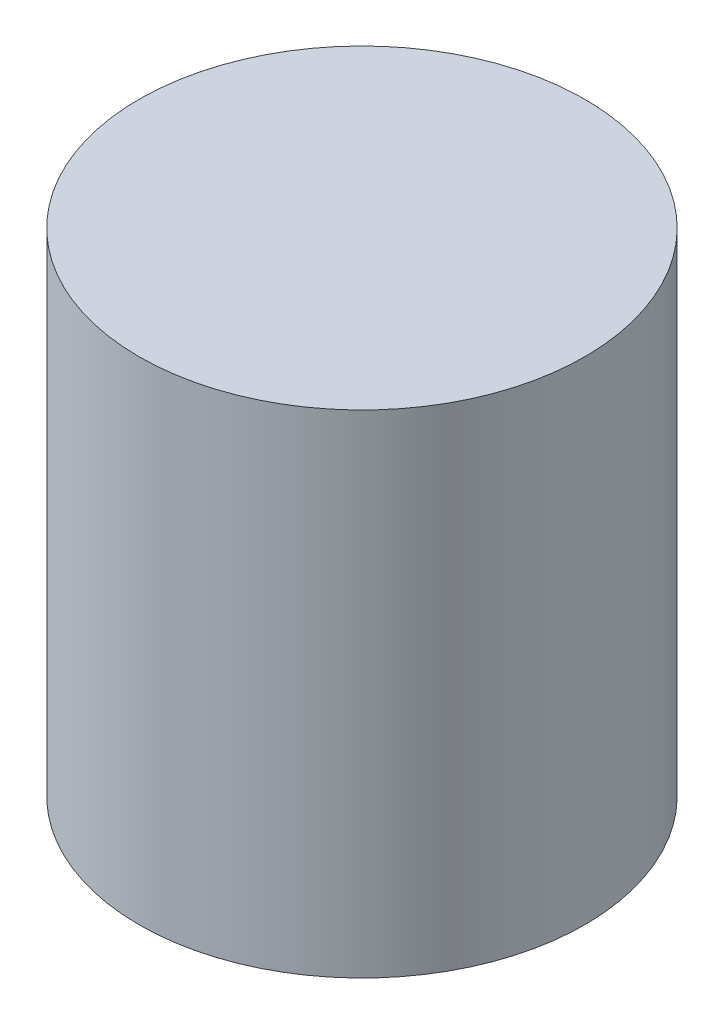
ISO-10303-21;
HEADER;
FILE_DESCRIPTION(('STEP AP214'),'2;1');
FILE_NAME('part.step','',(''),(''),'','','');
FILE_SCHEMA(('AUTOMOTIVE_DESIGN { 1 0 10303 214 1 1 1 1 }'));
ENDSEC;
DATA;
#1=APPLICATION_CONTEXT('core data for automotive mechanical design processes');
#2=APPLICATION_PROTOCOL_DEFINITION('international standard','automotive_design',2000,#1);
#3=PRODUCT_CONTEXT('',#1,'mechanical');
#4=PRODUCT('Part','Part','',(#3));
#5=PRODUCT_RELATED_PRODUCT_CATEGORY('part','',(#4));
#6=PRODUCT_DEFINITION_FORMATION('','',#4);
#7=PRODUCT_DEFINITION_CONTEXT('part definition',#1,'design');
#8=PRODUCT_DEFINITION('design','',#6,#7);
#9=PRODUCT_DEFINITION_SHAPE('','',#8);
#10=(LENGTH_UNIT() NAMED_UNIT(*) SI_UNIT(.MILLI.,.METRE.));
#11=(NAMED_UNIT(*) PLANE_ANGLE_UNIT() SI_UNIT($,.RADIAN.));
#12=(NAMED_UNIT(*) SI_UNIT($,.STERADIAN.) SOLID_ANGLE_UNIT());
#13=UNCERTAINTY_MEASURE_WITH_UNIT(LENGTH_MEASURE(1.E-05),#10,'distance_accuracy_value','');
#14=(GEOMETRIC_REPRESENTATION_CONTEXT(3) GLOBAL_UNCERTAINTY_ASSIGNED_CONTEXT((#13)) GLOBAL_UNIT_ASSIGNED_CONTEXT((#10,
#11,#12)) REPRESENTATION_CONTEXT('',''));
#15=CARTESIAN_POINT('',(0.,0.,0.));
#16=DIRECTION('',(0.,0.,1.));
#17=DIRECTION('',(1.,0.,0.));
#18=AXIS2_PLACEMENT_3D('',#15,#16,#17);
#19=CARTESIAN_POINT('',(0.,32.,0.));
#20=DIRECTION('',(0.,-1.,0.));
#21=DIRECTION('',(0.,0.,-1.));
#22=AXIS2_PLACEMENT_3D('',#19,#20,#21);
#23=CYLINDRICAL_SURFACE('',#22,14.5);
#24=CARTESIAN_POINT('',(0.,32.,0.));
#25=DIRECTION('',(0.,1.,0.));
#26=DIRECTION('',(0.,0.,1.));
#27=AXIS2_PLACEMENT_3D('',#24,#25,#26);
#28=CIRCLE('',#27,14.5);
#29=CARTESIAN_POINT('',(0.,32.,14.5));
#30=VERTEX_POINT('',#29);
#31=EDGE_CURVE('E10',#30,#30,#28,.T.);
#32=ORIENTED_EDGE('',*,*,#31,.F.);
#33=EDGE_LOOP('',(#32));
#34=FACE_BOUND('',#33,.T.);
#35=CARTESIAN_POINT('',(0.,0.,0.));
#36=DIRECTION('',(0.,1.,0.));
#37=DIRECTION('',(0.,0.,1.));
#38=AXIS2_PLACEMENT_3D('',#35,#36,#37);
#39=CIRCLE('',#38,14.5);
#40=CARTESIAN_POINT('',(0.,0.,14.5));
#41=VERTEX_POINT('',#40);
#42=EDGE_CURVE('E40',#41,#41,#39,.T.);
#43=ORIENTED_EDGE('',*,*,#42,.T.);
#44=EDGE_LOOP('',(#43));
#45=FACE_BOUND('',#44,.T.);
#46=ADVANCED_FACE('F37',(#34,#45),#23,.T.);
#47=CARTESIAN_POINT('',(0.,32.,0.));
#48=DIRECTION('',(0.,1.,0.));
#49=DIRECTION('',(0.,0.,1.));
#50=AXIS2_PLACEMENT_3D('',#47,#48,#49);
#51=PLANE('',#50);
#52=ORIENTED_EDGE('',*,*,#31,.T.);
#53=EDGE_LOOP('',(#52));
#54=FACE_BOUND('',#53,.T.);
#55=ADVANCED_FACE('F54',(#54),#51,.T.);
#56=CARTESIAN_POINT('',(0.,0.,0.));
#57=DIRECTION('',(0.,1.,0.));
#58=DIRECTION('',(0.,0.,1.));
#59=AXIS2_PLACEMENT_3D('',#56,#57,#58);
#60=PLANE('',#59);
#61=ORIENTED_EDGE('',*,*,#42,.F.);
#62=EDGE_LOOP('',(#61));
#63=FACE_BOUND('',#62,.T.);
#64=ADVANCED_FACE('F52',(#63),#60,.F.);
#65=CLOSED_SHELL('',(#46,#55,#64));
#66=MANIFOLD_SOLID_BREP('B2',#65);
#67=ADVANCED_BREP_SHAPE_REPRESENTATION('',(#18,#66),#14);
#68=SHAPE_DEFINITION_REPRESENTATION(#9,#67);
ENDSEC;
END-ISO-10303-21;
